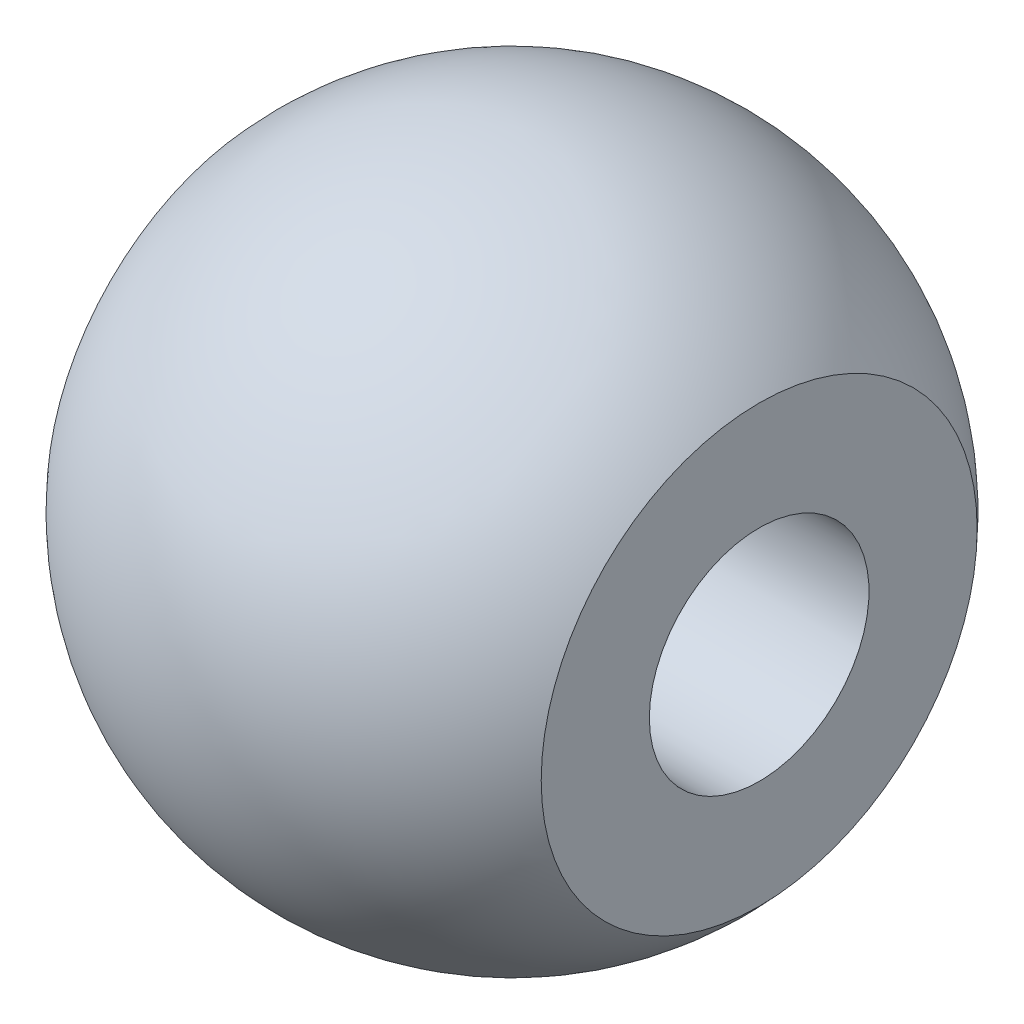
ISO-10303-21;
HEADER;
FILE_DESCRIPTION(('STEP AP214'),'2;1');
FILE_NAME('part.step','',(''),(''),'','','');
FILE_SCHEMA(('AUTOMOTIVE_DESIGN { 1 0 10303 214 1 1 1 1 }'));
ENDSEC;
DATA;
#1=APPLICATION_CONTEXT('core data for automotive mechanical design processes');
#2=APPLICATION_PROTOCOL_DEFINITION('international standard','automotive_design',2000,#1);
#3=PRODUCT_CONTEXT('',#1,'mechanical');
#4=PRODUCT('Part','Part','',(#3));
#5=PRODUCT_RELATED_PRODUCT_CATEGORY('part','',(#4));
#6=PRODUCT_DEFINITION_FORMATION('','',#4);
#7=PRODUCT_DEFINITION_CONTEXT('part definition',#1,'design');
#8=PRODUCT_DEFINITION('design','',#6,#7);
#9=PRODUCT_DEFINITION_SHAPE('','',#8);
#10=(LENGTH_UNIT() NAMED_UNIT(*) SI_UNIT(.MILLI.,.METRE.));
#11=(NAMED_UNIT(*) PLANE_ANGLE_UNIT() SI_UNIT($,.RADIAN.));
#12=(NAMED_UNIT(*) SI_UNIT($,.STERADIAN.) SOLID_ANGLE_UNIT());
#13=UNCERTAINTY_MEASURE_WITH_UNIT(LENGTH_MEASURE(1.E-05),#10,'distance_accuracy_value','');
#14=(GEOMETRIC_REPRESENTATION_CONTEXT(3) GLOBAL_UNCERTAINTY_ASSIGNED_CONTEXT((#13)) GLOBAL_UNIT_ASSIGNED_CONTEXT((#10,
#11,#12)) REPRESENTATION_CONTEXT('',''));
#15=CARTESIAN_POINT('',(0.,0.,0.));
#16=DIRECTION('',(0.,0.,1.));
#17=DIRECTION('',(1.,0.,0.));
#18=AXIS2_PLACEMENT_3D('',#15,#16,#17);
#19=CARTESIAN_POINT('',(0.,0.,0.));
#20=DIRECTION('',(-1.,0.,0.));
#21=DIRECTION('',(0.,0.,-1.));
#22=AXIS2_PLACEMENT_3D('',#19,#20,#21);
#23=SPHERICAL_SURFACE('',#22,6.);
#24=CARTESIAN_POINT('',(-4.5,0.,0.));
#25=DIRECTION('',(-1.,0.,0.));
#26=DIRECTION('',(0.,0.,1.));
#27=AXIS2_PLACEMENT_3D('',#24,#25,#26);
#28=CIRCLE('',#27,3.96862696659689);
#29=CARTESIAN_POINT('',(-4.5,0.,-3.96862696659689));
#30=VERTEX_POINT('',#29);
#31=EDGE_CURVE('E45',#30,#30,#28,.T.);
#32=CARTESIAN_POINT('',(4.5,0.,0.));
#33=DIRECTION('',(-1.,0.,0.));
#34=DIRECTION('',(0.,0.,1.));
#35=AXIS2_PLACEMENT_3D('',#32,#33,#34);
#36=CIRCLE('',#35,3.96862696659689);
#37=CARTESIAN_POINT('',(4.5,0.,-3.96862696659689));
#38=VERTEX_POINT('',#37);
#39=EDGE_CURVE('E49',#38,#38,#36,.T.);
#40=CARTESIAN_POINT('',(-4.5,0.,-3.96862696659689));
#41=CARTESIAN_POINT('',(-4.42988448417367,0.,-4.04813476780702));
#42=CARTESIAN_POINT('',(-4.35765791170532,0.,-4.12578044526497));
#43=CARTESIAN_POINT('',(-4.20919440386366,0.,-4.27713817883407));
#44=CARTESIAN_POINT('',(-4.13295746849034,0.,-4.35085023494521));
#45=CARTESIAN_POINT('',(-3.97668498521782,0.,-4.4941313519782));
#46=CARTESIAN_POINT('',(-3.89664943731862,0.,-4.56370041290005));
#47=CARTESIAN_POINT('',(-3.73300516695228,0.,-4.69850076282097));
#48=CARTESIAN_POINT('',(-3.64939644448515,0.,-4.76373205182003));
#49=CARTESIAN_POINT('',(-3.47884049038039,0.,-4.8896734716426));
#50=CARTESIAN_POINT('',(-3.39189325874275,0.,-4.9503836024661));
#51=CARTESIAN_POINT('',(-3.21490454544201,0.,-5.06711223105534));
#52=CARTESIAN_POINT('',(-3.1248630637789,0.,-5.12313072882108));
#53=CARTESIAN_POINT('',(-2.94193874249415,0.,-5.23031873710099));
#54=CARTESIAN_POINT('',(-2.84905590287251,0.,-5.28148824761517));
#55=CARTESIAN_POINT('',(-2.66070975397032,0.,-5.37883456206913));
#56=CARTESIAN_POINT('',(-2.56524644468976,0.,-5.42501136600891));
#57=CARTESIAN_POINT('',(-2.37200748850401,0.,-5.51224256718487));
#58=CARTESIAN_POINT('',(-2.27423184159881,0.,-5.55329696442104));
#59=CARTESIAN_POINT('',(-2.07664283810176,0.,-5.63016804073458));
#60=CARTESIAN_POINT('',(-1.9768294815099,0.,-5.66598471981195));
#61=CARTESIAN_POINT('',(-1.77544540970266,0.,-5.73227975951892));
#62=CARTESIAN_POINT('',(-1.67387469448727,0.,-5.76275812014852));
#63=CARTESIAN_POINT('',(-1.46926119256368,0.,-5.81829091677091));
#64=CARTESIAN_POINT('',(-1.36621840585547,0.,-5.84334535276371));
#65=CARTESIAN_POINT('',(-1.1589501827416,0.,-5.8879599283703));
#66=CARTESIAN_POINT('',(-1.05472474633594,0.,-5.90752006798411));
#67=CARTESIAN_POINT('',(-0.84538396739988,0.,-5.94109111122104));
#68=CARTESIAN_POINT('',(-0.740268624869486,0.,-5.95510201484416));
#69=CARTESIAN_POINT('',(-0.529443276782204,0.,-5.97753523292316));
#70=CARTESIAN_POINT('',(-0.423733271225316,0.,-5.98595754737904));
#71=CARTESIAN_POINT('',(-0.212015510445618,0.,-5.99718993091746));
#72=CARTESIAN_POINT('',(-0.106007755222808,0.,-6.));
#73=CARTESIAN_POINT('',(0.106007755222812,0.,-6.));
#74=CARTESIAN_POINT('',(0.212015510445622,0.,-5.99718993091746));
#75=CARTESIAN_POINT('',(0.42373327122532,0.,-5.98595754737904));
#76=CARTESIAN_POINT('',(0.529443276782208,0.,-5.97753523292316));
#77=CARTESIAN_POINT('',(0.74026862486949,0.,-5.95510201484416));
#78=CARTESIAN_POINT('',(0.845383967399884,0.,-5.94109111122104));
#79=CARTESIAN_POINT('',(1.05472474633594,0.,-5.90752006798411));
#80=CARTESIAN_POINT('',(1.15895018274161,0.,-5.8879599283703));
#81=CARTESIAN_POINT('',(1.36621840585548,0.,-5.8433453527637));
#82=CARTESIAN_POINT('',(1.46926119256368,0.,-5.81829091677091));
#83=CARTESIAN_POINT('',(1.67387469448727,0.,-5.76275812014852));
#84=CARTESIAN_POINT('',(1.77544540970266,0.,-5.73227975951892));
#85=CARTESIAN_POINT('',(1.97682948150991,0.,-5.66598471981195));
#86=CARTESIAN_POINT('',(2.07664283810176,0.,-5.63016804073458));
#87=CARTESIAN_POINT('',(2.27423184159881,0.,-5.55329696442104));
#88=CARTESIAN_POINT('',(2.37200748850401,0.,-5.51224256718487));
#89=CARTESIAN_POINT('',(2.56524644468976,0.,-5.42501136600891));
#90=CARTESIAN_POINT('',(2.66070975397032,0.,-5.37883456206913));
#91=CARTESIAN_POINT('',(2.84905590287252,0.,-5.28148824761517));
#92=CARTESIAN_POINT('',(2.94193874249415,0.,-5.23031873710099));
#93=CARTESIAN_POINT('',(3.1248630637789,0.,-5.12313072882108));
#94=CARTESIAN_POINT('',(3.21490454544201,0.,-5.06711223105534));
#95=CARTESIAN_POINT('',(3.39189325874276,0.,-4.9503836024661));
#96=CARTESIAN_POINT('',(3.47884049038039,0.,-4.8896734716426));
#97=CARTESIAN_POINT('',(3.64939644448516,0.,-4.76373205182003));
#98=CARTESIAN_POINT('',(3.73300516695229,0.,-4.69850076282096));
#99=CARTESIAN_POINT('',(3.89664943731862,0.,-4.56370041290005));
#100=CARTESIAN_POINT('',(3.97668498521783,0.,-4.4941313519782));
#101=CARTESIAN_POINT('',(4.13295746849034,0.,-4.35085023494521));
#102=CARTESIAN_POINT('',(4.20919440386366,0.,-4.27713817883407));
#103=CARTESIAN_POINT('',(4.35765791170532,0.,-4.12578044526497));
#104=CARTESIAN_POINT('',(4.42988448417367,0.,-4.04813476780701));
#105=CARTESIAN_POINT('',(4.5,0.,-3.96862696659689));
#106=B_SPLINE_CURVE_WITH_KNOTS('',3,(#40,#41,#42,#43,#44,#45,#46,#47,#48,#49,#50,#51,#52,#53,
#54,#55,#56,#57,#58,#59,#60,#61,#62,#63,#64,#65,#66,#67,#68,#69,#70,#71,#72,#73,#74,#75,#76,#77,
#78,#79,#80,#81,#82,#83,#84,#85,#86,#87,#88,#89,#90,#91,#92,#93,#94,#95,#96,#97,#98,#99,#100,
#101,#102,#103,#104,#105),.UNSPECIFIED.,.F.,.F.,(4,2,2,2,2,2,2,2,2,2,2,2,2,2,2,2,2,2,2,2,2,2,2,
2,2,2,2,2,2,2,2,2,4),(0.,0.317986053500719,0.635972107001436,0.953958160502156,1.27194421400287,
1.58993026750359,1.90791632100431,2.22590237450503,2.54388842800575,2.86187448150647,
3.17986053500719,3.4978465885079,3.81583264200862,4.13381869550934,4.45180474901006,
4.76979080251078,5.0877768560115,5.40576290951221,5.72374896301293,6.04173501651365,
6.35972107001437,6.67770712351509,6.99569317701581,7.31367923051652,7.63166528401724,
7.94965133751796,8.26763739101868,8.5856234445194,8.90360949802012,9.22159555152083,
9.53958160502155,9.85756765852227,10.175553712023),.UNSPECIFIED.);
#107=EDGE_CURVE('BSEAM33',#30,#38,#106,.T.);
#108=ORIENTED_EDGE('',*,*,#31,.F.);
#109=ORIENTED_EDGE('',*,*,#39,.T.);
#110=ORIENTED_EDGE('',*,*,#107,.T.);
#111=ORIENTED_EDGE('',*,*,#107,.F.);
#112=EDGE_LOOP('',(#108,#110,#109,#111));
#113=FACE_BOUND('',#112,.T.);
#114=ADVANCED_FACE('F33',(#113),#23,.T.);
#115=CARTESIAN_POINT('',(-4.5,0.,-3.96862696659689));
#116=DIRECTION('',(1.,0.,0.));
#117=DIRECTION('',(0.,0.,-1.));
#118=AXIS2_PLACEMENT_3D('',#115,#116,#117);
#119=PLANE('',#118);
#120=CARTESIAN_POINT('',(-4.5,0.,0.));
#121=DIRECTION('',(1.,0.,0.));
#122=DIRECTION('',(0.,0.,-1.));
#123=AXIS2_PLACEMENT_3D('',#120,#121,#122);
#124=CIRCLE('',#123,3.);
#125=CARTESIAN_POINT('',(-4.5,0.,-3.));
#126=VERTEX_POINT('',#125);
#127=EDGE_CURVE('E10',#126,#126,#124,.T.);
#128=ORIENTED_EDGE('',*,*,#127,.T.);
#129=EDGE_LOOP('',(#128));
#130=FACE_BOUND('',#129,.T.);
#131=ORIENTED_EDGE('',*,*,#31,.T.);
#132=EDGE_LOOP('',(#131));
#133=FACE_BOUND('',#132,.T.);
#134=ADVANCED_FACE('F69',(#130,#133),#119,.F.);
#135=CARTESIAN_POINT('',(4.5,0.,-3.96862696659689));
#136=DIRECTION('',(1.,0.,0.));
#137=DIRECTION('',(0.,0.,-1.));
#138=AXIS2_PLACEMENT_3D('',#135,#136,#137);
#139=PLANE('',#138);
#140=CARTESIAN_POINT('',(4.5,0.,0.));
#141=DIRECTION('',(-1.,0.,0.));
#142=DIRECTION('',(0.,0.,1.));
#143=AXIS2_PLACEMENT_3D('',#140,#141,#142);
#144=CIRCLE('',#143,2.);
#145=CARTESIAN_POINT('',(4.5,0.,2.));
#146=VERTEX_POINT('',#145);
#147=EDGE_CURVE('E54',#146,#146,#144,.T.);
#148=ORIENTED_EDGE('',*,*,#147,.T.);
#149=EDGE_LOOP('',(#148));
#150=FACE_BOUND('',#149,.T.);
#151=ORIENTED_EDGE('',*,*,#39,.F.);
#152=EDGE_LOOP('',(#151));
#153=FACE_BOUND('',#152,.T.);
#154=ADVANCED_FACE('F58',(#150,#153),#139,.T.);
#155=CARTESIAN_POINT('',(4.5,0.,0.));
#156=DIRECTION('',(-1.,0.,0.));
#157=DIRECTION('',(0.,0.,1.));
#158=AXIS2_PLACEMENT_3D('',#155,#156,#157);
#159=CYLINDRICAL_SURFACE('',#158,2.);
#160=CARTESIAN_POINT('',(-3.5,0.,0.));
#161=DIRECTION('',(1.,0.,0.));
#162=DIRECTION('',(0.,0.,-1.));
#163=AXIS2_PLACEMENT_3D('',#160,#161,#162);
#164=CIRCLE('',#163,2.);
#165=CARTESIAN_POINT('',(-3.5,0.,-2.));
#166=VERTEX_POINT('',#165);
#167=EDGE_CURVE('E41',#166,#166,#164,.F.);
#168=ORIENTED_EDGE('',*,*,#167,.T.);
#169=EDGE_LOOP('',(#168));
#170=FACE_BOUND('',#169,.T.);
#171=ORIENTED_EDGE('',*,*,#147,.F.);
#172=EDGE_LOOP('',(#171));
#173=FACE_BOUND('',#172,.T.);
#174=ADVANCED_FACE('F61',(#170,#173),#159,.F.);
#175=CARTESIAN_POINT('',(-3.5,0.,0.));
#176=DIRECTION('',(-1.,0.,0.));
#177=DIRECTION('',(0.,0.,1.));
#178=AXIS2_PLACEMENT_3D('',#175,#176,#177);
#179=CONICAL_SURFACE('',#178,2.,0.785398163397451);
#180=ORIENTED_EDGE('',*,*,#127,.F.);
#181=EDGE_LOOP('',(#180));
#182=FACE_BOUND('',#181,.T.);
#183=ORIENTED_EDGE('',*,*,#167,.F.);
#184=EDGE_LOOP('',(#183));
#185=FACE_BOUND('',#184,.T.);
#186=ADVANCED_FACE('F36',(#182,#185),#179,.F.);
#187=CLOSED_SHELL('',(#114,#134,#154,#174,#186));
#188=MANIFOLD_SOLID_BREP('B2',#187);
#189=ADVANCED_BREP_SHAPE_REPRESENTATION('',(#18,#188),#14);
#190=SHAPE_DEFINITION_REPRESENTATION(#9,#189);
ENDSEC;
END-ISO-10303-21;
